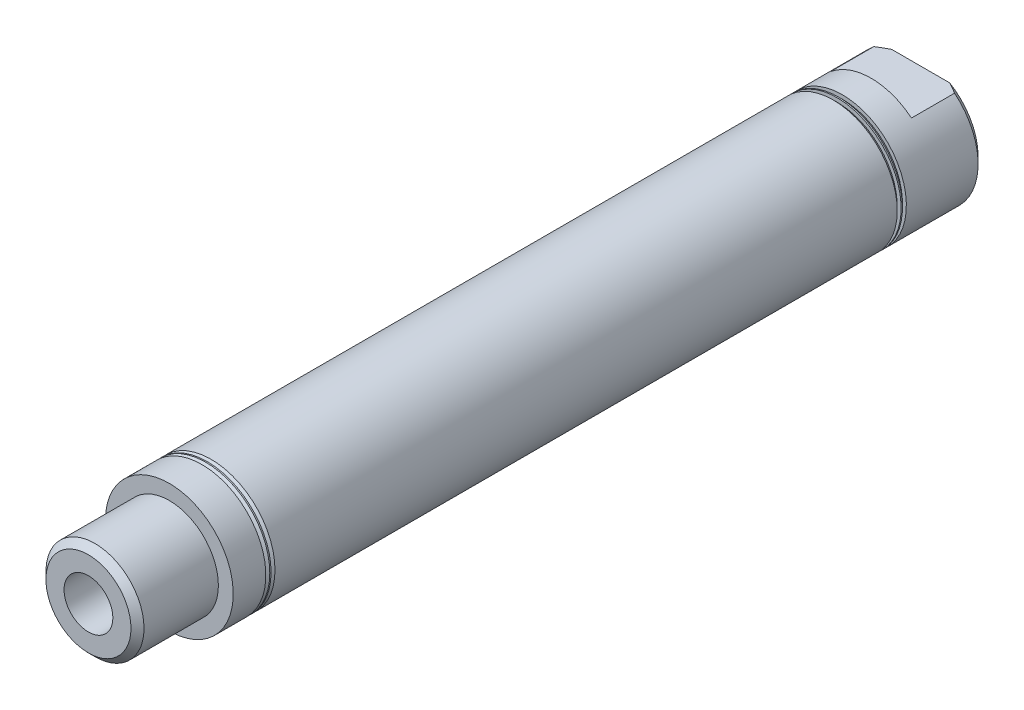
ISO-10303-21;
HEADER;
FILE_DESCRIPTION(('STEP AP214'),'2;1');
FILE_NAME('part.step','',(''),(''),'','','');
FILE_SCHEMA(('AUTOMOTIVE_DESIGN { 1 0 10303 214 1 1 1 1 }'));
ENDSEC;
DATA;
#1=APPLICATION_CONTEXT('core data for automotive mechanical design processes');
#2=APPLICATION_PROTOCOL_DEFINITION('international standard','automotive_design',2000,#1);
#3=PRODUCT_CONTEXT('',#1,'mechanical');
#4=PRODUCT('Part','Part','',(#3));
#5=PRODUCT_RELATED_PRODUCT_CATEGORY('part','',(#4));
#6=PRODUCT_DEFINITION_FORMATION('','',#4);
#7=PRODUCT_DEFINITION_CONTEXT('part definition',#1,'design');
#8=PRODUCT_DEFINITION('design','',#6,#7);
#9=PRODUCT_DEFINITION_SHAPE('','',#8);
#10=(LENGTH_UNIT() NAMED_UNIT(*) SI_UNIT(.MILLI.,.METRE.));
#11=(NAMED_UNIT(*) PLANE_ANGLE_UNIT() SI_UNIT($,.RADIAN.));
#12=(NAMED_UNIT(*) SI_UNIT($,.STERADIAN.) SOLID_ANGLE_UNIT());
#13=UNCERTAINTY_MEASURE_WITH_UNIT(LENGTH_MEASURE(1.E-05),#10,'distance_accuracy_value','');
#14=(GEOMETRIC_REPRESENTATION_CONTEXT(3) GLOBAL_UNCERTAINTY_ASSIGNED_CONTEXT((#13)) GLOBAL_UNIT_ASSIGNED_CONTEXT((#10,
#11,#12)) REPRESENTATION_CONTEXT('',''));
#15=CARTESIAN_POINT('',(0.,0.,0.));
#16=DIRECTION('',(0.,0.,1.));
#17=DIRECTION('',(1.,0.,0.));
#18=AXIS2_PLACEMENT_3D('',#15,#16,#17);
#19=CARTESIAN_POINT('',(2.0193,0.,-71.374));
#20=DIRECTION('',(0.,0.,1.));
#21=DIRECTION('',(1.,0.,0.));
#22=AXIS2_PLACEMENT_3D('',#19,#20,#21);
#23=PLANE('',#22);
#24=CARTESIAN_POINT('',(0.,0.,-71.374));
#25=DIRECTION('',(0.,0.,-1.));
#26=DIRECTION('',(-1.,0.,0.));
#27=AXIS2_PLACEMENT_3D('',#24,#25,#26);
#28=CIRCLE('',#27,2.0193);
#29=CARTESIAN_POINT('',(2.0193,0.,-71.374));
#30=VERTEX_POINT('',#29);
#31=EDGE_CURVE('E228',#30,#30,#28,.T.);
#32=ORIENTED_EDGE('',*,*,#31,.F.);
#33=EDGE_LOOP('',(#32));
#34=FACE_BOUND('',#33,.T.);
#35=CARTESIAN_POINT('',(0.,0.,-71.374));
#36=DIRECTION('',(0.,0.,-1.));
#37=DIRECTION('',(-1.,0.,0.));
#38=AXIS2_PLACEMENT_3D('',#35,#36,#37);
#39=CIRCLE('',#38,2.413);
#40=CARTESIAN_POINT('',(2.413,0.,-71.374));
#41=VERTEX_POINT('',#40);
#42=EDGE_CURVE('E232',#41,#41,#39,.T.);
#43=ORIENTED_EDGE('',*,*,#42,.T.);
#44=EDGE_LOOP('',(#43));
#45=FACE_BOUND('',#44,.T.);
#46=ADVANCED_FACE('F17',(#34,#45),#23,.F.);
#47=CARTESIAN_POINT('',(0.,0.,-76.2));
#48=DIRECTION('',(0.,0.,1.));
#49=DIRECTION('',(1.,0.,0.));
#50=AXIS2_PLACEMENT_3D('',#47,#48,#49);
#51=PLANE('',#50);
#52=CARTESIAN_POINT('',(0.,0.,-76.2));
#53=DIRECTION('',(0.,0.,1.));
#54=DIRECTION('',(1.,0.,0.));
#55=AXIS2_PLACEMENT_3D('',#52,#53,#54);
#56=CIRCLE('',#55,6.223);
#57=CARTESIAN_POINT('',(-3.92879790775753,-4.826,-76.2));
#58=VERTEX_POINT('',#57);
#59=CARTESIAN_POINT('',(3.92879790775753,-4.826,-76.2));
#60=VERTEX_POINT('',#59);
#61=EDGE_CURVE('E286',#58,#60,#56,.T.);
#62=ORIENTED_EDGE('',*,*,#61,.F.);
#63=DIRECTION('',(-1.,0.,0.));
#64=VECTOR('',#63,1.);
#65=CARTESIAN_POINT('',(3.92879790775753,-4.826,-76.2));
#66=LINE('',#65,#64);
#67=EDGE_CURVE('E11',#60,#58,#66,.T.);
#68=ORIENTED_EDGE('',*,*,#67,.F.);
#69=EDGE_LOOP('',(#62,#68));
#70=FACE_BOUND('',#69,.T.);
#71=ADVANCED_FACE('F359',(#70),#51,.F.);
#72=CARTESIAN_POINT('',(3.92879790775753,-4.826,-76.2));
#73=DIRECTION('',(0.,-1.,0.));
#74=DIRECTION('',(0.,0.,-1.));
#75=AXIS2_PLACEMENT_3D('',#72,#73,#74);
#76=PLANE('',#75);
#77=DIRECTION('',(0.,0.,-1.));
#78=VECTOR('',#77,1.);
#79=CARTESIAN_POINT('',(3.92879790775753,-4.826,-76.2));
#80=LINE('',#79,#78);
#81=CARTESIAN_POINT('',(3.92879790775753,-4.826,-80.391));
#82=VERTEX_POINT('',#81);
#83=EDGE_CURVE('E283',#60,#82,#80,.T.);
#84=ORIENTED_EDGE('',*,*,#83,.F.);
#85=ORIENTED_EDGE('',*,*,#67,.T.);
#86=DIRECTION('',(0.,0.,-1.));
#87=VECTOR('',#86,1.);
#88=CARTESIAN_POINT('',(-3.92879790775753,-4.826,-76.2));
#89=LINE('',#88,#87);
#90=CARTESIAN_POINT('',(-3.92879790775753,-4.826,-80.391));
#91=VERTEX_POINT('',#90);
#92=EDGE_CURVE('E284',#58,#91,#89,.T.);
#93=ORIENTED_EDGE('',*,*,#92,.T.);
#94=CARTESIAN_POINT('',(-2.81699627262537,-4.826,-81.0260000000013));
#95=CARTESIAN_POINT('',(-3.3430099495075,-4.826,-80.7608284597136));
#96=CARTESIAN_POINT('',(-3.92879790785972,-4.826,-80.3909999999354));
#97=(BOUNDED_CURVE() B_SPLINE_CURVE(2,(#94,#95,#96),.UNSPECIFIED.,.F.,
.F.) B_SPLINE_CURVE_WITH_KNOTS((3,3),(1.74716911100756,1.91098172248345),
.UNSPECIFIED.) CURVE() GEOMETRIC_REPRESENTATION_ITEM() RATIONAL_B_SPLINE_CURVE((1.5594392164396,
1.52071721469553,1.46981627295729)) REPRESENTATION_ITEM(''));
#98=CARTESIAN_POINT('',(-2.81699627262797,-4.826,-81.026));
#99=VERTEX_POINT('',#98);
#100=EDGE_CURVE('E191',#99,#91,#97,.T.);
#101=ORIENTED_EDGE('',*,*,#100,.F.);
#102=DIRECTION('',(-1.,0.,0.));
#103=VECTOR('',#102,1.);
#104=CARTESIAN_POINT('',(3.92879790775753,-4.826,-81.026));
#105=LINE('',#104,#103);
#106=CARTESIAN_POINT('',(2.81699627262797,-4.826,-81.026));
#107=VERTEX_POINT('',#106);
#108=EDGE_CURVE('E184',#107,#99,#105,.T.);
#109=ORIENTED_EDGE('',*,*,#108,.F.);
#110=CARTESIAN_POINT('',(3.92879790775753,-4.826,-80.3910000000005));
#111=CARTESIAN_POINT('',(3.34300994946202,-4.826,-80.7608284597366));
#112=CARTESIAN_POINT('',(2.81699627262535,-4.826,-81.0260000000013));
#113=(BOUNDED_CURVE() B_SPLINE_CURVE(2,(#110,#111,#112),.UNSPECIFIED.,.F.,
.F.) B_SPLINE_CURVE_WITH_KNOTS((3,3),(0.541697335186386,0.705509946676079),
.UNSPECIFIED.) CURVE() GEOMETRIC_REPRESENTATION_ITEM() RATIONAL_B_SPLINE_CURVE((1.46981627296587,
1.52071721469879,1.5594392164396)) REPRESENTATION_ITEM(''));
#114=EDGE_CURVE('E188',#82,#107,#113,.T.);
#115=ORIENTED_EDGE('',*,*,#114,.F.);
#116=EDGE_LOOP('',(#84,#85,#93,#101,#109,#115));
#117=FACE_BOUND('',#116,.T.);
#118=ADVANCED_FACE('F187',(#117),#76,.T.);
#119=CARTESIAN_POINT('',(0.,0.,-76.2));
#120=DIRECTION('',(0.,0.,1.));
#121=DIRECTION('',(1.,0.,0.));
#122=AXIS2_PLACEMENT_3D('',#119,#120,#121);
#123=PLANE('',#122);
#124=CARTESIAN_POINT('',(0.,0.,-76.2));
#125=DIRECTION('',(0.,0.,1.));
#126=DIRECTION('',(1.,0.,0.));
#127=AXIS2_PLACEMENT_3D('',#124,#125,#126);
#128=CIRCLE('',#127,6.223);
#129=CARTESIAN_POINT('',(3.92879790775753,4.826,-76.2));
#130=VERTEX_POINT('',#129);
#131=CARTESIAN_POINT('',(-3.92879790775753,4.826,-76.2));
#132=VERTEX_POINT('',#131);
#133=EDGE_CURVE('E268',#130,#132,#128,.T.);
#134=ORIENTED_EDGE('',*,*,#133,.F.);
#135=DIRECTION('',(1.,0.,0.));
#136=VECTOR('',#135,1.);
#137=CARTESIAN_POINT('',(3.92879790775753,4.826,-76.2));
#138=LINE('',#137,#136);
#139=EDGE_CURVE('E21',#132,#130,#138,.T.);
#140=ORIENTED_EDGE('',*,*,#139,.F.);
#141=EDGE_LOOP('',(#134,#140));
#142=FACE_BOUND('',#141,.T.);
#143=ADVANCED_FACE('F377',(#142),#123,.F.);
#144=CARTESIAN_POINT('',(3.92879790775753,4.826,-76.2));
#145=DIRECTION('',(0.,1.,0.));
#146=DIRECTION('',(1.,0.,0.));
#147=AXIS2_PLACEMENT_3D('',#144,#145,#146);
#148=PLANE('',#147);
#149=DIRECTION('',(0.,0.,-1.));
#150=VECTOR('',#149,1.);
#151=CARTESIAN_POINT('',(-3.92879790775753,4.826,-76.2));
#152=LINE('',#151,#150);
#153=CARTESIAN_POINT('',(-3.92879790775753,4.826,-80.391));
#154=VERTEX_POINT('',#153);
#155=EDGE_CURVE('E248',#132,#154,#152,.T.);
#156=ORIENTED_EDGE('',*,*,#155,.F.);
#157=ORIENTED_EDGE('',*,*,#139,.T.);
#158=DIRECTION('',(0.,0.,-1.));
#159=VECTOR('',#158,1.);
#160=CARTESIAN_POINT('',(3.92879790775753,4.826,-76.2));
#161=LINE('',#160,#159);
#162=CARTESIAN_POINT('',(3.92879790775754,4.826,-80.391));
#163=VERTEX_POINT('',#162);
#164=EDGE_CURVE('E277',#130,#163,#161,.T.);
#165=ORIENTED_EDGE('',*,*,#164,.T.);
#166=CARTESIAN_POINT('',(2.81699627262543,4.826,-81.0260000000013));
#167=CARTESIAN_POINT('',(3.34300994950755,4.826,-80.7608284597136));
#168=CARTESIAN_POINT('',(3.92879790785974,4.826,-80.3909999999354));
#169=(BOUNDED_CURVE() B_SPLINE_CURVE(2,(#166,#167,#168),.UNSPECIFIED.,.F.,
.F.) B_SPLINE_CURVE_WITH_KNOTS((3,3),(1.74716911100756,1.91098172248345),
.UNSPECIFIED.) CURVE() GEOMETRIC_REPRESENTATION_ITEM() RATIONAL_B_SPLINE_CURVE((1.55943921643959,
1.52071721469552,1.46981627295729)) REPRESENTATION_ITEM(''));
#170=CARTESIAN_POINT('',(2.81699627262797,4.826,-81.026));
#171=VERTEX_POINT('',#170);
#172=EDGE_CURVE('E213',#171,#163,#169,.T.);
#173=ORIENTED_EDGE('',*,*,#172,.F.);
#174=DIRECTION('',(1.,0.,0.));
#175=VECTOR('',#174,1.);
#176=CARTESIAN_POINT('',(3.92879790775753,4.826,-81.026));
#177=LINE('',#176,#175);
#178=CARTESIAN_POINT('',(-2.81699627262797,4.826,-81.026));
#179=VERTEX_POINT('',#178);
#180=EDGE_CURVE('E210',#179,#171,#177,.T.);
#181=ORIENTED_EDGE('',*,*,#180,.F.);
#182=CARTESIAN_POINT('',(-3.92879790775753,4.826,-80.3910000000005));
#183=CARTESIAN_POINT('',(-3.34300994946202,4.826,-80.7608284597366));
#184=CARTESIAN_POINT('',(-2.81699627262536,4.826,-81.0260000000013));
#185=(BOUNDED_CURVE() B_SPLINE_CURVE(2,(#182,#183,#184),.UNSPECIFIED.,.F.,
.F.) B_SPLINE_CURVE_WITH_KNOTS((3,3),(0.541697335186386,0.705509946676081),
.UNSPECIFIED.) CURVE() GEOMETRIC_REPRESENTATION_ITEM() RATIONAL_B_SPLINE_CURVE((1.46981627296587,
1.52071721469879,1.5594392164396)) REPRESENTATION_ITEM(''));
#186=EDGE_CURVE('E40',#154,#179,#185,.T.);
#187=ORIENTED_EDGE('',*,*,#186,.F.);
#188=EDGE_LOOP('',(#156,#157,#165,#173,#181,#187));
#189=FACE_BOUND('',#188,.T.);
#190=ADVANCED_FACE('F384',(#189),#148,.T.);
#191=CARTESIAN_POINT('',(0.,6.223,-73.406));
#192=DIRECTION('',(0.,0.,1.));
#193=DIRECTION('',(1.,0.,0.));
#194=AXIS2_PLACEMENT_3D('',#191,#192,#193);
#195=PLANE('',#194);
#196=CARTESIAN_POINT('',(0.,0.,-73.406));
#197=DIRECTION('',(0.,0.,1.));
#198=DIRECTION('',(1.,0.,0.));
#199=AXIS2_PLACEMENT_3D('',#196,#197,#198);
#200=CIRCLE('',#199,5.842);
#201=CARTESIAN_POINT('',(-5.842,0.,-73.406));
#202=VERTEX_POINT('',#201);
#203=EDGE_CURVE('E253',#202,#202,#200,.T.);
#204=ORIENTED_EDGE('',*,*,#203,.F.);
#205=EDGE_LOOP('',(#204));
#206=FACE_BOUND('',#205,.T.);
#207=CARTESIAN_POINT('',(0.,0.,-73.406));
#208=DIRECTION('',(0.,0.,1.));
#209=DIRECTION('',(1.,0.,0.));
#210=AXIS2_PLACEMENT_3D('',#207,#208,#209);
#211=CIRCLE('',#210,6.223);
#212=CARTESIAN_POINT('',(-6.223,0.,-73.406));
#213=VERTEX_POINT('',#212);
#214=EDGE_CURVE('E197',#213,#213,#211,.T.);
#215=ORIENTED_EDGE('',*,*,#214,.T.);
#216=EDGE_LOOP('',(#215));
#217=FACE_BOUND('',#216,.T.);
#218=ADVANCED_FACE('F19',(#206,#217),#195,.T.);
#219=CARTESIAN_POINT('',(0.,6.223,-72.898));
#220=DIRECTION('',(0.,0.,1.));
#221=DIRECTION('',(1.,0.,0.));
#222=AXIS2_PLACEMENT_3D('',#219,#220,#221);
#223=PLANE('',#222);
#224=CARTESIAN_POINT('',(0.,0.,-72.898));
#225=DIRECTION('',(0.,0.,1.));
#226=DIRECTION('',(1.,0.,0.));
#227=AXIS2_PLACEMENT_3D('',#224,#225,#226);
#228=CIRCLE('',#227,5.842);
#229=CARTESIAN_POINT('',(-5.842,0.,-72.898));
#230=VERTEX_POINT('',#229);
#231=EDGE_CURVE('E252',#230,#230,#228,.T.);
#232=ORIENTED_EDGE('',*,*,#231,.F.);
#233=EDGE_LOOP('',(#232));
#234=FACE_BOUND('',#233,.T.);
#235=CARTESIAN_POINT('',(0.,0.,-72.898));
#236=DIRECTION('',(0.,0.,1.));
#237=DIRECTION('',(1.,0.,0.));
#238=AXIS2_PLACEMENT_3D('',#235,#236,#237);
#239=CIRCLE('',#238,6.223);
#240=CARTESIAN_POINT('',(-6.223,0.,-72.898));
#241=VERTEX_POINT('',#240);
#242=EDGE_CURVE('E214',#241,#241,#239,.T.);
#243=ORIENTED_EDGE('',*,*,#242,.T.);
#244=EDGE_LOOP('',(#243));
#245=FACE_BOUND('',#244,.T.);
#246=ADVANCED_FACE('F570',(#234,#245),#223,.T.);
#247=CARTESIAN_POINT('',(0.,5.55625,-25.4));
#248=DIRECTION('',(0.,0.,1.));
#249=DIRECTION('',(1.,0.,0.));
#250=AXIS2_PLACEMENT_3D('',#247,#248,#249);
#251=PLANE('',#250);
#252=CARTESIAN_POINT('',(0.,0.,-25.4));
#253=DIRECTION('',(0.,0.,-1.));
#254=DIRECTION('',(-1.,0.,0.));
#255=AXIS2_PLACEMENT_3D('',#252,#253,#254);
#256=CIRCLE('',#255,2.3749);
#257=CARTESIAN_POINT('',(2.3749,0.,-25.4));
#258=VERTEX_POINT('',#257);
#259=EDGE_CURVE('E226',#258,#258,#256,.T.);
#260=ORIENTED_EDGE('',*,*,#259,.F.);
#261=EDGE_LOOP('',(#260));
#262=FACE_BOUND('',#261,.T.);
#263=CARTESIAN_POINT('',(0.,0.,-25.4));
#264=DIRECTION('',(0.,0.,-1.));
#265=DIRECTION('',(-1.,0.,0.));
#266=AXIS2_PLACEMENT_3D('',#263,#264,#265);
#267=CIRCLE('',#266,5.55625);
#268=CARTESIAN_POINT('',(5.55625,0.,-25.4));
#269=VERTEX_POINT('',#268);
#270=EDGE_CURVE('E272',#269,#269,#267,.T.);
#271=ORIENTED_EDGE('',*,*,#270,.T.);
#272=EDGE_LOOP('',(#271));
#273=FACE_BOUND('',#272,.T.);
#274=ADVANCED_FACE('F575',(#262,#273),#251,.F.);
#275=CARTESIAN_POINT('',(0.,0.,-63.5));
#276=DIRECTION('',(0.,0.,-1.));
#277=DIRECTION('',(0.,-1.,0.));
#278=AXIS2_PLACEMENT_3D('',#275,#276,#277);
#279=PLANE('',#278);
#280=CARTESIAN_POINT('',(0.,0.,-63.5));
#281=DIRECTION('',(0.,0.,-1.));
#282=DIRECTION('',(-1.,0.,0.));
#283=AXIS2_PLACEMENT_3D('',#280,#281,#282);
#284=CIRCLE('',#283,5.55625);
#285=CARTESIAN_POINT('',(5.55625,0.,-63.5));
#286=VERTEX_POINT('',#285);
#287=EDGE_CURVE('E306',#286,#286,#284,.T.);
#288=ORIENTED_EDGE('',*,*,#287,.F.);
#289=EDGE_LOOP('',(#288));
#290=FACE_BOUND('',#289,.T.);
#291=ADVANCED_FACE('F524',(#290),#279,.F.);
#292=CARTESIAN_POINT('',(0.,6.223,-11.557));
#293=DIRECTION('',(0.,0.,-1.));
#294=DIRECTION('',(0.,-1.,0.));
#295=AXIS2_PLACEMENT_3D('',#292,#293,#294);
#296=PLANE('',#295);
#297=CARTESIAN_POINT('',(0.,0.,-11.557));
#298=DIRECTION('',(0.,0.,1.));
#299=DIRECTION('',(1.,0.,0.));
#300=AXIS2_PLACEMENT_3D('',#297,#298,#299);
#301=CIRCLE('',#300,5.842);
#302=CARTESIAN_POINT('',(5.842,0.,-11.557));
#303=VERTEX_POINT('',#302);
#304=EDGE_CURVE('E269',#303,#303,#301,.T.);
#305=ORIENTED_EDGE('',*,*,#304,.T.);
#306=EDGE_LOOP('',(#305));
#307=FACE_BOUND('',#306,.T.);
#308=CARTESIAN_POINT('',(0.,0.,-11.557));
#309=DIRECTION('',(0.,0.,1.));
#310=DIRECTION('',(1.,0.,0.));
#311=AXIS2_PLACEMENT_3D('',#308,#309,#310);
#312=CIRCLE('',#311,6.223);
#313=CARTESIAN_POINT('',(-6.223,0.,-11.557));
#314=VERTEX_POINT('',#313);
#315=EDGE_CURVE('E222',#314,#314,#312,.T.);
#316=ORIENTED_EDGE('',*,*,#315,.F.);
#317=EDGE_LOOP('',(#316));
#318=FACE_BOUND('',#317,.T.);
#319=ADVANCED_FACE('F519',(#307,#318),#296,.T.);
#320=CARTESIAN_POINT('',(0.,6.223,-11.049));
#321=DIRECTION('',(0.,0.,-1.));
#322=DIRECTION('',(0.,-1.,0.));
#323=AXIS2_PLACEMENT_3D('',#320,#321,#322);
#324=PLANE('',#323);
#325=CARTESIAN_POINT('',(0.,0.,-11.049));
#326=DIRECTION('',(0.,0.,1.));
#327=DIRECTION('',(1.,0.,0.));
#328=AXIS2_PLACEMENT_3D('',#325,#326,#327);
#329=CIRCLE('',#328,5.842);
#330=CARTESIAN_POINT('',(5.842,0.,-11.049));
#331=VERTEX_POINT('',#330);
#332=EDGE_CURVE('E237',#331,#331,#329,.T.);
#333=ORIENTED_EDGE('',*,*,#332,.T.);
#334=EDGE_LOOP('',(#333));
#335=FACE_BOUND('',#334,.T.);
#336=CARTESIAN_POINT('',(0.,0.,-11.049));
#337=DIRECTION('',(0.,0.,1.));
#338=DIRECTION('',(1.,0.,0.));
#339=AXIS2_PLACEMENT_3D('',#336,#337,#338);
#340=CIRCLE('',#339,6.223);
#341=CARTESIAN_POINT('',(-6.223,0.,-11.049));
#342=VERTEX_POINT('',#341);
#343=EDGE_CURVE('E304',#342,#342,#340,.T.);
#344=ORIENTED_EDGE('',*,*,#343,.F.);
#345=EDGE_LOOP('',(#344));
#346=FACE_BOUND('',#345,.T.);
#347=ADVANCED_FACE('F447',(#335,#346),#324,.T.);
#348=CARTESIAN_POINT('',(0.,4.7752,0.));
#349=DIRECTION('',(0.,0.,-1.));
#350=DIRECTION('',(0.,-1.,0.));
#351=AXIS2_PLACEMENT_3D('',#348,#349,#350);
#352=PLANE('',#351);
#353=CARTESIAN_POINT('',(0.,0.,0.));
#354=DIRECTION('',(0.,0.,-1.));
#355=DIRECTION('',(-1.,0.,0.));
#356=AXIS2_PLACEMENT_3D('',#353,#354,#355);
#357=CIRCLE('',#356,2.3749);
#358=CARTESIAN_POINT('',(2.3749,0.,0.));
#359=VERTEX_POINT('',#358);
#360=EDGE_CURVE('E334',#359,#359,#357,.T.);
#361=ORIENTED_EDGE('',*,*,#360,.T.);
#362=EDGE_LOOP('',(#361));
#363=FACE_BOUND('',#362,.T.);
#364=CARTESIAN_POINT('',(0.,0.,0.));
#365=DIRECTION('',(0.,0.,1.));
#366=DIRECTION('',(-1.,0.,0.));
#367=AXIS2_PLACEMENT_3D('',#364,#365,#366);
#368=CIRCLE('',#367,4.1402);
#369=CARTESIAN_POINT('',(4.1402,0.,0.));
#370=VERTEX_POINT('',#369);
#371=EDGE_CURVE('E242',#370,#370,#368,.T.);
#372=ORIENTED_EDGE('',*,*,#371,.T.);
#373=EDGE_LOOP('',(#372));
#374=FACE_BOUND('',#373,.T.);
#375=ADVANCED_FACE('F442',(#363,#374),#352,.F.);
#376=CARTESIAN_POINT('',(0.,6.223,-7.874));
#377=DIRECTION('',(0.,0.,-1.));
#378=DIRECTION('',(0.,-1.,0.));
#379=AXIS2_PLACEMENT_3D('',#376,#377,#378);
#380=PLANE('',#379);
#381=CARTESIAN_POINT('',(0.,0.,-7.874));
#382=DIRECTION('',(0.,0.,1.));
#383=DIRECTION('',(1.,0.,0.));
#384=AXIS2_PLACEMENT_3D('',#381,#382,#383);
#385=CIRCLE('',#384,4.7752);
#386=CARTESIAN_POINT('',(-4.7752,0.,-7.874));
#387=VERTEX_POINT('',#386);
#388=EDGE_CURVE('E294',#387,#387,#385,.T.);
#389=ORIENTED_EDGE('',*,*,#388,.F.);
#390=EDGE_LOOP('',(#389));
#391=FACE_BOUND('',#390,.T.);
#392=CARTESIAN_POINT('',(0.,0.,-7.874));
#393=DIRECTION('',(0.,0.,1.));
#394=DIRECTION('',(1.,0.,0.));
#395=AXIS2_PLACEMENT_3D('',#392,#393,#394);
#396=CIRCLE('',#395,6.223);
#397=CARTESIAN_POINT('',(-6.223,0.,-7.874));
#398=VERTEX_POINT('',#397);
#399=EDGE_CURVE('E258',#398,#398,#396,.T.);
#400=ORIENTED_EDGE('',*,*,#399,.T.);
#401=EDGE_LOOP('',(#400));
#402=FACE_BOUND('',#401,.T.);
#403=ADVANCED_FACE('F354',(#391,#402),#380,.F.);
#404=CARTESIAN_POINT('',(0.,0.,-80.391));
#405=DIRECTION('',(0.,0.,1.));
#406=DIRECTION('',(-1.,0.,0.));
#407=AXIS2_PLACEMENT_3D('',#404,#405,#406);
#408=CONICAL_SURFACE('',#407,6.223,0.785398163397447);
#409=CARTESIAN_POINT('',(0.,0.,-81.026));
#410=DIRECTION('',(0.,0.,-1.));
#411=DIRECTION('',(1.,0.,0.));
#412=AXIS2_PLACEMENT_3D('',#409,#410,#411);
#413=CIRCLE('',#412,5.588);
#414=EDGE_CURVE('E196',#99,#179,#413,.T.);
#415=ORIENTED_EDGE('',*,*,#414,.F.);
#416=ORIENTED_EDGE('',*,*,#100,.T.);
#417=CARTESIAN_POINT('',(0.,0.,-80.391));
#418=DIRECTION('',(0.,0.,1.));
#419=DIRECTION('',(1.,0.,0.));
#420=AXIS2_PLACEMENT_3D('',#417,#418,#419);
#421=CIRCLE('',#420,6.223);
#422=EDGE_CURVE('E207',#154,#91,#421,.T.);
#423=ORIENTED_EDGE('',*,*,#422,.F.);
#424=ORIENTED_EDGE('',*,*,#186,.T.);
#425=EDGE_LOOP('',(#415,#416,#423,#424));
#426=FACE_BOUND('',#425,.T.);
#427=ADVANCED_FACE('F346',(#426),#408,.T.);
#428=CARTESIAN_POINT('',(0.,0.,-81.026));
#429=DIRECTION('',(0.,0.,1.));
#430=DIRECTION('',(1.,0.,0.));
#431=AXIS2_PLACEMENT_3D('',#428,#429,#430);
#432=PLANE('',#431);
#433=CARTESIAN_POINT('',(0.,0.,-81.026));
#434=DIRECTION('',(0.,0.,-1.));
#435=DIRECTION('',(-1.,0.,0.));
#436=AXIS2_PLACEMENT_3D('',#433,#434,#435);
#437=CIRCLE('',#436,2.413);
#438=CARTESIAN_POINT('',(2.413,0.,-81.026));
#439=VERTEX_POINT('',#438);
#440=EDGE_CURVE('E297',#439,#439,#437,.T.);
#441=ORIENTED_EDGE('',*,*,#440,.F.);
#442=EDGE_LOOP('',(#441));
#443=FACE_BOUND('',#442,.T.);
#444=ORIENTED_EDGE('',*,*,#108,.T.);
#445=ORIENTED_EDGE('',*,*,#414,.T.);
#446=ORIENTED_EDGE('',*,*,#180,.T.);
#447=CARTESIAN_POINT('',(0.,0.,-81.026));
#448=DIRECTION('',(0.,0.,-1.));
#449=DIRECTION('',(1.,0.,0.));
#450=AXIS2_PLACEMENT_3D('',#447,#448,#449);
#451=CIRCLE('',#450,5.588);
#452=EDGE_CURVE('E203',#171,#107,#451,.T.);
#453=ORIENTED_EDGE('',*,*,#452,.T.);
#454=EDGE_LOOP('',(#444,#445,#446,#453));
#455=FACE_BOUND('',#454,.T.);
#456=ADVANCED_FACE('F209',(#443,#455),#432,.F.);
#457=CARTESIAN_POINT('',(0.,0.,21.4174471685587));
#458=DIRECTION('',(0.,0.,1.));
#459=DIRECTION('',(1.,0.,0.));
#460=AXIS2_PLACEMENT_3D('',#457,#458,#459);
#461=CYLINDRICAL_SURFACE('',#460,6.223);
#462=ORIENTED_EDGE('',*,*,#214,.F.);
#463=EDGE_LOOP('',(#462));
#464=FACE_BOUND('',#463,.T.);
#465=ORIENTED_EDGE('',*,*,#422,.T.);
#466=ORIENTED_EDGE('',*,*,#92,.F.);
#467=ORIENTED_EDGE('',*,*,#61,.T.);
#468=ORIENTED_EDGE('',*,*,#83,.T.);
#469=CARTESIAN_POINT('',(0.,0.,-80.391));
#470=DIRECTION('',(0.,0.,1.));
#471=DIRECTION('',(1.,0.,0.));
#472=AXIS2_PLACEMENT_3D('',#469,#470,#471);
#473=CIRCLE('',#472,6.223);
#474=EDGE_CURVE('E205',#82,#163,#473,.T.);
#475=ORIENTED_EDGE('',*,*,#474,.T.);
#476=ORIENTED_EDGE('',*,*,#164,.F.);
#477=ORIENTED_EDGE('',*,*,#133,.T.);
#478=ORIENTED_EDGE('',*,*,#155,.T.);
#479=EDGE_LOOP('',(#465,#466,#467,#468,#475,#476,#477,#478));
#480=FACE_BOUND('',#479,.T.);
#481=ADVANCED_FACE('F345',(#464,#480),#461,.T.);
#482=CARTESIAN_POINT('',(0.,0.,-80.391));
#483=DIRECTION('',(0.,0.,1.));
#484=DIRECTION('',(1.,0.,0.));
#485=AXIS2_PLACEMENT_3D('',#482,#483,#484);
#486=CONICAL_SURFACE('',#485,6.223,0.785398163397447);
#487=ORIENTED_EDGE('',*,*,#452,.F.);
#488=ORIENTED_EDGE('',*,*,#172,.T.);
#489=ORIENTED_EDGE('',*,*,#474,.F.);
#490=ORIENTED_EDGE('',*,*,#114,.T.);
#491=EDGE_LOOP('',(#487,#488,#489,#490));
#492=FACE_BOUND('',#491,.T.);
#493=ADVANCED_FACE('F201',(#492),#486,.T.);
#494=CARTESIAN_POINT('',(0.,0.,21.4174471685587));
#495=DIRECTION('',(0.,0.,1.));
#496=DIRECTION('',(1.,0.,0.));
#497=AXIS2_PLACEMENT_3D('',#494,#495,#496);
#498=CYLINDRICAL_SURFACE('',#497,6.223);
#499=ORIENTED_EDGE('',*,*,#242,.F.);
#500=EDGE_LOOP('',(#499));
#501=FACE_BOUND('',#500,.T.);
#502=CARTESIAN_POINT('',(0.,0.,-73.025));
#503=DIRECTION('',(0.,0.,1.));
#504=DIRECTION('',(1.,0.,0.));
#505=AXIS2_PLACEMENT_3D('',#502,#503,#504);
#506=CIRCLE('',#505,6.223);
#507=CARTESIAN_POINT('',(-6.223,0.,-73.025));
#508=VERTEX_POINT('',#507);
#509=EDGE_CURVE('E249',#508,#508,#506,.T.);
#510=ORIENTED_EDGE('',*,*,#509,.T.);
#511=EDGE_LOOP('',(#510));
#512=FACE_BOUND('',#511,.T.);
#513=ADVANCED_FACE('F374',(#501,#512),#498,.T.);
#514=CARTESIAN_POINT('',(0.,0.,21.4174471685587));
#515=DIRECTION('',(0.,0.,1.));
#516=DIRECTION('',(1.,0.,0.));
#517=AXIS2_PLACEMENT_3D('',#514,#515,#516);
#518=CYLINDRICAL_SURFACE('',#517,6.223);
#519=CARTESIAN_POINT('',(0.,0.,-11.938));
#520=DIRECTION('',(0.,0.,1.));
#521=DIRECTION('',(1.,0.,0.));
#522=AXIS2_PLACEMENT_3D('',#519,#520,#521);
#523=CIRCLE('',#522,6.223);
#524=CARTESIAN_POINT('',(6.223,0.,-11.938));
#525=VERTEX_POINT('',#524);
#526=EDGE_CURVE('E241',#525,#525,#523,.T.);
#527=ORIENTED_EDGE('',*,*,#526,.F.);
#528=EDGE_LOOP('',(#527));
#529=FACE_BOUND('',#528,.T.);
#530=CARTESIAN_POINT('',(0.,0.,-72.517));
#531=DIRECTION('',(0.,0.,1.));
#532=DIRECTION('',(1.,0.,0.));
#533=AXIS2_PLACEMENT_3D('',#530,#531,#532);
#534=CIRCLE('',#533,6.223);
#535=CARTESIAN_POINT('',(-6.223,0.,-72.517));
#536=VERTEX_POINT('',#535);
#537=EDGE_CURVE('E254',#536,#536,#534,.T.);
#538=ORIENTED_EDGE('',*,*,#537,.T.);
#539=EDGE_LOOP('',(#538));
#540=FACE_BOUND('',#539,.T.);
#541=ADVANCED_FACE('F494',(#529,#540),#518,.T.);
#542=CARTESIAN_POINT('',(0.,0.,21.4174471685587));
#543=DIRECTION('',(0.,0.,1.));
#544=DIRECTION('',(1.,0.,0.));
#545=AXIS2_PLACEMENT_3D('',#542,#543,#544);
#546=CYLINDRICAL_SURFACE('',#545,6.223);
#547=CARTESIAN_POINT('',(0.,0.,-11.43));
#548=DIRECTION('',(0.,0.,1.));
#549=DIRECTION('',(1.,0.,0.));
#550=AXIS2_PLACEMENT_3D('',#547,#548,#549);
#551=CIRCLE('',#550,6.223);
#552=CARTESIAN_POINT('',(6.223,0.,-11.43));
#553=VERTEX_POINT('',#552);
#554=EDGE_CURVE('E240',#553,#553,#551,.T.);
#555=ORIENTED_EDGE('',*,*,#554,.F.);
#556=EDGE_LOOP('',(#555));
#557=FACE_BOUND('',#556,.T.);
#558=ORIENTED_EDGE('',*,*,#315,.T.);
#559=EDGE_LOOP('',(#558));
#560=FACE_BOUND('',#559,.T.);
#561=ADVANCED_FACE('F489',(#557,#560),#546,.T.);
#562=CARTESIAN_POINT('',(0.,0.,21.4174471685587));
#563=DIRECTION('',(0.,0.,1.));
#564=DIRECTION('',(1.,0.,0.));
#565=AXIS2_PLACEMENT_3D('',#562,#563,#564);
#566=CYLINDRICAL_SURFACE('',#565,6.223);
#567=ORIENTED_EDGE('',*,*,#399,.F.);
#568=EDGE_LOOP('',(#567));
#569=FACE_BOUND('',#568,.T.);
#570=ORIENTED_EDGE('',*,*,#343,.T.);
#571=EDGE_LOOP('',(#570));
#572=FACE_BOUND('',#571,.T.);
#573=ADVANCED_FACE('F381',(#569,#572),#566,.T.);
#574=CARTESIAN_POINT('',(0.,0.,21.4174471685587));
#575=DIRECTION('',(0.,0.,1.));
#576=DIRECTION('',(1.,0.,0.));
#577=AXIS2_PLACEMENT_3D('',#574,#575,#576);
#578=CYLINDRICAL_SURFACE('',#577,4.7752);
#579=CARTESIAN_POINT('',(0.,0.,-0.635));
#580=DIRECTION('',(0.,0.,-1.));
#581=DIRECTION('',(-1.,0.,0.));
#582=AXIS2_PLACEMENT_3D('',#579,#580,#581);
#583=CIRCLE('',#582,4.7752);
#584=CARTESIAN_POINT('',(4.7752,0.,-0.635));
#585=VERTEX_POINT('',#584);
#586=EDGE_CURVE('E244',#585,#585,#583,.T.);
#587=ORIENTED_EDGE('',*,*,#586,.T.);
#588=EDGE_LOOP('',(#587));
#589=FACE_BOUND('',#588,.T.);
#590=ORIENTED_EDGE('',*,*,#388,.T.);
#591=EDGE_LOOP('',(#590));
#592=FACE_BOUND('',#591,.T.);
#593=ADVANCED_FACE('F378',(#589,#592),#578,.T.);
#594=CARTESIAN_POINT('',(0.,0.,-11.049));
#595=DIRECTION('',(0.,0.,-1.));
#596=DIRECTION('',(-1.,0.,0.));
#597=AXIS2_PLACEMENT_3D('',#594,#595,#596);
#598=CONICAL_SURFACE('',#597,5.842,0.78539816339745);
#599=ORIENTED_EDGE('',*,*,#554,.T.);
#600=EDGE_LOOP('',(#599));
#601=FACE_BOUND('',#600,.T.);
#602=ORIENTED_EDGE('',*,*,#332,.F.);
#603=EDGE_LOOP('',(#602));
#604=FACE_BOUND('',#603,.T.);
#605=ADVANCED_FACE('F380',(#601,#604),#598,.T.);
#606=CARTESIAN_POINT('',(0.,0.,-11.557));
#607=DIRECTION('',(0.,0.,-1.));
#608=DIRECTION('',(-1.,0.,0.));
#609=AXIS2_PLACEMENT_3D('',#606,#607,#608);
#610=CONICAL_SURFACE('',#609,5.842,0.785398163397448);
#611=ORIENTED_EDGE('',*,*,#526,.T.);
#612=EDGE_LOOP('',(#611));
#613=FACE_BOUND('',#612,.T.);
#614=ORIENTED_EDGE('',*,*,#304,.F.);
#615=EDGE_LOOP('',(#614));
#616=FACE_BOUND('',#615,.T.);
#617=ADVANCED_FACE('F547',(#613,#616),#610,.T.);
#618=CARTESIAN_POINT('',(0.,0.,0.));
#619=DIRECTION('',(0.,0.,-1.));
#620=DIRECTION('',(-1.,0.,0.));
#621=AXIS2_PLACEMENT_3D('',#618,#619,#620);
#622=CYLINDRICAL_SURFACE('',#621,5.55625);
#623=ORIENTED_EDGE('',*,*,#270,.F.);
#624=EDGE_LOOP('',(#623));
#625=FACE_BOUND('',#624,.T.);
#626=ORIENTED_EDGE('',*,*,#287,.T.);
#627=EDGE_LOOP('',(#626));
#628=FACE_BOUND('',#627,.T.);
#629=ADVANCED_FACE('F482',(#625,#628),#622,.F.);
#630=CARTESIAN_POINT('',(0.,0.,0.));
#631=DIRECTION('',(0.,0.,-1.));
#632=DIRECTION('',(-1.,0.,0.));
#633=AXIS2_PLACEMENT_3D('',#630,#631,#632);
#634=CYLINDRICAL_SURFACE('',#633,2.3749);
#635=ORIENTED_EDGE('',*,*,#360,.F.);
#636=EDGE_LOOP('',(#635));
#637=FACE_BOUND('',#636,.T.);
#638=ORIENTED_EDGE('',*,*,#259,.T.);
#639=EDGE_LOOP('',(#638));
#640=FACE_BOUND('',#639,.T.);
#641=ADVANCED_FACE('F471',(#637,#640),#634,.F.);
#642=CARTESIAN_POINT('',(0.,0.,-72.517));
#643=DIRECTION('',(0.,0.,1.));
#644=DIRECTION('',(1.,0.,0.));
#645=AXIS2_PLACEMENT_3D('',#642,#643,#644);
#646=CONICAL_SURFACE('',#645,6.223,0.785398163397466);
#647=ORIENTED_EDGE('',*,*,#537,.F.);
#648=EDGE_LOOP('',(#647));
#649=FACE_BOUND('',#648,.T.);
#650=ORIENTED_EDGE('',*,*,#231,.T.);
#651=EDGE_LOOP('',(#650));
#652=FACE_BOUND('',#651,.T.);
#653=ADVANCED_FACE('F465',(#649,#652),#646,.T.);
#654=CARTESIAN_POINT('',(0.,0.,-73.025));
#655=DIRECTION('',(0.,0.,1.));
#656=DIRECTION('',(1.,0.,0.));
#657=AXIS2_PLACEMENT_3D('',#654,#655,#656);
#658=CONICAL_SURFACE('',#657,6.223,0.785398163397448);
#659=ORIENTED_EDGE('',*,*,#509,.F.);
#660=EDGE_LOOP('',(#659));
#661=FACE_BOUND('',#660,.T.);
#662=ORIENTED_EDGE('',*,*,#203,.T.);
#663=EDGE_LOOP('',(#662));
#664=FACE_BOUND('',#663,.T.);
#665=ADVANCED_FACE('F470',(#661,#664),#658,.T.);
#666=CARTESIAN_POINT('',(0.,0.,0.));
#667=DIRECTION('',(0.,0.,-1.));
#668=DIRECTION('',(-1.,0.,0.));
#669=AXIS2_PLACEMENT_3D('',#666,#667,#668);
#670=CONICAL_SURFACE('',#669,4.1402,0.785398163397448);
#671=ORIENTED_EDGE('',*,*,#586,.F.);
#672=EDGE_LOOP('',(#671));
#673=FACE_BOUND('',#672,.T.);
#674=ORIENTED_EDGE('',*,*,#371,.F.);
#675=EDGE_LOOP('',(#674));
#676=FACE_BOUND('',#675,.T.);
#677=ADVANCED_FACE('F619',(#673,#676),#670,.T.);
#678=CARTESIAN_POINT('',(0.,0.,-67.4120064));
#679=DIRECTION('',(0.,0.,-1.));
#680=DIRECTION('',(-1.,0.,0.));
#681=AXIS2_PLACEMENT_3D('',#678,#679,#680);
#682=CONICAL_SURFACE('',#681,2.0193,1.02974425867665);
#683=CARTESIAN_POINT('',(0.,0.,-66.1986885519977));
#684=VERTEX_POINT('',#683);
#685=VERTEX_LOOP('',#684);
#686=FACE_BOUND('',#685,.T.);
#687=CARTESIAN_POINT('',(0.,0.,-67.4120064));
#688=DIRECTION('',(0.,0.,-1.));
#689=DIRECTION('',(-1.,0.,0.));
#690=AXIS2_PLACEMENT_3D('',#687,#688,#689);
#691=CIRCLE('',#690,2.0193);
#692=CARTESIAN_POINT('',(2.0193,0.,-67.4120064));
#693=VERTEX_POINT('',#692);
#694=EDGE_CURVE('E231',#693,#693,#691,.T.);
#695=ORIENTED_EDGE('',*,*,#694,.T.);
#696=EDGE_LOOP('',(#695));
#697=FACE_BOUND('',#696,.T.);
#698=ADVANCED_FACE('F585',(#686,#697),#682,.F.);
#699=CARTESIAN_POINT('',(0.,0.,-81.026));
#700=DIRECTION('',(0.,0.,-1.));
#701=DIRECTION('',(-1.,0.,0.));
#702=AXIS2_PLACEMENT_3D('',#699,#700,#701);
#703=CYLINDRICAL_SURFACE('',#702,2.0193);
#704=ORIENTED_EDGE('',*,*,#694,.F.);
#705=EDGE_LOOP('',(#704));
#706=FACE_BOUND('',#705,.T.);
#707=ORIENTED_EDGE('',*,*,#31,.T.);
#708=EDGE_LOOP('',(#707));
#709=FACE_BOUND('',#708,.T.);
#710=ADVANCED_FACE('F458',(#706,#709),#703,.F.);
#711=CARTESIAN_POINT('',(0.,0.,-81.026));
#712=DIRECTION('',(0.,0.,-1.));
#713=DIRECTION('',(-1.,0.,0.));
#714=AXIS2_PLACEMENT_3D('',#711,#712,#713);
#715=CYLINDRICAL_SURFACE('',#714,2.413);
#716=ORIENTED_EDGE('',*,*,#42,.F.);
#717=EDGE_LOOP('',(#716));
#718=FACE_BOUND('',#717,.T.);
#719=ORIENTED_EDGE('',*,*,#440,.T.);
#720=EDGE_LOOP('',(#719));
#721=FACE_BOUND('',#720,.T.);
#722=ADVANCED_FACE('F342',(#718,#721),#715,.F.);
#723=CLOSED_SHELL('',(#46,#71,#118,#143,#190,#218,#246,#274,#291,#319,#347,#375,#403,#427,#456,
#481,#493,#513,#541,#561,#573,#593,#605,#617,#629,#641,#653,#665,#677,#698,#710,#722));
#724=MANIFOLD_SOLID_BREP('B1',#723);
#725=ADVANCED_BREP_SHAPE_REPRESENTATION('',(#18,#724),#14);
#726=SHAPE_DEFINITION_REPRESENTATION(#9,#725);
ENDSEC;
END-ISO-10303-21;
